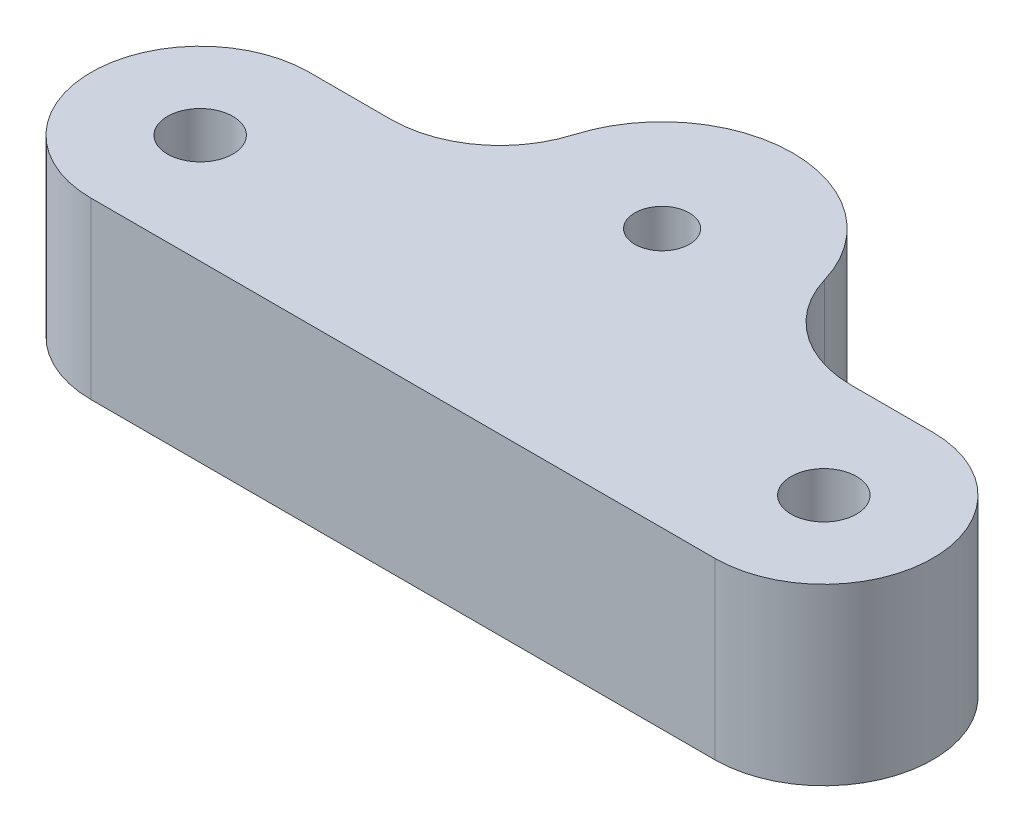
ISO-10303-21;
HEADER;
FILE_DESCRIPTION(('STEP AP214'),'2;1');
FILE_NAME('part.step','',(''),(''),'','','');
FILE_SCHEMA(('AUTOMOTIVE_DESIGN { 1 0 10303 214 1 1 1 1 }'));
ENDSEC;
DATA;
#1=APPLICATION_CONTEXT('core data for automotive mechanical design processes');
#2=APPLICATION_PROTOCOL_DEFINITION('international standard','automotive_design',2000,#1);
#3=PRODUCT_CONTEXT('',#1,'mechanical');
#4=PRODUCT('Part','Part','',(#3));
#5=PRODUCT_RELATED_PRODUCT_CATEGORY('part','',(#4));
#6=PRODUCT_DEFINITION_FORMATION('','',#4);
#7=PRODUCT_DEFINITION_CONTEXT('part definition',#1,'design');
#8=PRODUCT_DEFINITION('design','',#6,#7);
#9=PRODUCT_DEFINITION_SHAPE('','',#8);
#10=(LENGTH_UNIT() NAMED_UNIT(*) SI_UNIT(.MILLI.,.METRE.));
#11=(NAMED_UNIT(*) PLANE_ANGLE_UNIT() SI_UNIT($,.RADIAN.));
#12=(NAMED_UNIT(*) SI_UNIT($,.STERADIAN.) SOLID_ANGLE_UNIT());
#13=UNCERTAINTY_MEASURE_WITH_UNIT(LENGTH_MEASURE(1.E-05),#10,'distance_accuracy_value','');
#14=(GEOMETRIC_REPRESENTATION_CONTEXT(3) GLOBAL_UNCERTAINTY_ASSIGNED_CONTEXT((#13)) GLOBAL_UNIT_ASSIGNED_CONTEXT((#10,
#11,#12)) REPRESENTATION_CONTEXT('',''));
#15=CARTESIAN_POINT('',(0.,0.,0.));
#16=DIRECTION('',(0.,0.,1.));
#17=DIRECTION('',(1.,0.,0.));
#18=AXIS2_PLACEMENT_3D('',#15,#16,#17);
#19=CARTESIAN_POINT('',(-14.295,8.,-5.));
#20=DIRECTION('',(0.,0.,1.));
#21=DIRECTION('',(1.,0.,0.));
#22=AXIS2_PLACEMENT_3D('',#19,#20,#21);
#23=PLANE('',#22);
#24=DIRECTION('',(-1.,0.,0.));
#25=VECTOR('',#24,1.);
#26=CARTESIAN_POINT('',(-14.295,0.,-5.));
#27=LINE('',#26,#25);
#28=CARTESIAN_POINT('',(14.295,0.,-5.00000000000001));
#29=VERTEX_POINT('',#28);
#30=CARTESIAN_POINT('',(10.5482510398644,0.,-5.));
#31=VERTEX_POINT('',#30);
#32=EDGE_CURVE('E122',#29,#31,#27,.T.);
#33=ORIENTED_EDGE('',*,*,#32,.T.);
#34=DIRECTION('',(0.,1.,0.));
#35=VECTOR('',#34,1.);
#36=CARTESIAN_POINT('',(10.5482510398644,8.,-5.));
#37=LINE('',#36,#35);
#38=CARTESIAN_POINT('',(10.5482510398644,8.,-5.));
#39=VERTEX_POINT('',#38);
#40=EDGE_CURVE('E139',#31,#39,#37,.T.);
#41=ORIENTED_EDGE('',*,*,#40,.T.);
#42=DIRECTION('',(-1.,0.,0.));
#43=VECTOR('',#42,1.);
#44=CARTESIAN_POINT('',(-14.295,8.,-5.));
#45=LINE('',#44,#43);
#46=CARTESIAN_POINT('',(14.295,8.,-5.00000000000001));
#47=VERTEX_POINT('',#46);
#48=EDGE_CURVE('E149',#47,#39,#45,.T.);
#49=ORIENTED_EDGE('',*,*,#48,.F.);
#50=DIRECTION('',(0.,-1.,0.));
#51=VECTOR('',#50,1.);
#52=CARTESIAN_POINT('',(14.295,8.,-5.00000000000001));
#53=LINE('',#52,#51);
#54=EDGE_CURVE('E131',#47,#29,#53,.T.);
#55=ORIENTED_EDGE('',*,*,#54,.T.);
#56=EDGE_LOOP('',(#33,#41,#49,#55));
#57=FACE_BOUND('',#56,.T.);
#58=ADVANCED_FACE('F36',(#57),#23,.F.);
#59=CARTESIAN_POINT('',(-14.295,8.,0.));
#60=DIRECTION('',(0.,1.,0.));
#61=DIRECTION('',(0.,0.,1.));
#62=AXIS2_PLACEMENT_3D('',#59,#60,#61);
#63=PLANE('',#62);
#64=CARTESIAN_POINT('',(0.,8.,-6.88000000000001));
#65=DIRECTION('',(0.,-1.,0.));
#66=DIRECTION('',(0.,0.,-1.));
#67=AXIS2_PLACEMENT_3D('',#64,#65,#66);
#68=CIRCLE('',#67,1.25);
#69=CARTESIAN_POINT('',(0.,8.,-8.13));
#70=VERTEX_POINT('',#69);
#71=EDGE_CURVE('E230',#70,#70,#68,.T.);
#72=ORIENTED_EDGE('',*,*,#71,.T.);
#73=EDGE_LOOP('',(#72));
#74=FACE_BOUND('',#73,.T.);
#75=CARTESIAN_POINT('',(-14.295,8.,0.));
#76=DIRECTION('',(0.,1.,0.));
#77=DIRECTION('',(0.,0.,1.));
#78=AXIS2_PLACEMENT_3D('',#75,#76,#77);
#79=CIRCLE('',#78,1.5);
#80=CARTESIAN_POINT('',(-14.295,8.,1.5));
#81=VERTEX_POINT('',#80);
#82=EDGE_CURVE('E172',#81,#81,#79,.T.);
#83=ORIENTED_EDGE('',*,*,#82,.F.);
#84=EDGE_LOOP('',(#83));
#85=FACE_BOUND('',#84,.T.);
#86=CARTESIAN_POINT('',(-14.295,8.,0.));
#87=DIRECTION('',(0.,1.,0.));
#88=DIRECTION('',(0.,0.,1.));
#89=AXIS2_PLACEMENT_3D('',#86,#87,#88);
#90=CIRCLE('',#89,5.);
#91=CARTESIAN_POINT('',(-14.295,8.,-5.));
#92=VERTEX_POINT('',#91);
#93=CARTESIAN_POINT('',(-14.295,8.,5.));
#94=VERTEX_POINT('',#93);
#95=EDGE_CURVE('E112',#92,#94,#90,.T.);
#96=ORIENTED_EDGE('',*,*,#95,.T.);
#97=DIRECTION('',(1.,0.,0.));
#98=VECTOR('',#97,1.);
#99=CARTESIAN_POINT('',(-14.295,8.,5.));
#100=LINE('',#99,#98);
#101=CARTESIAN_POINT('',(14.295,8.,4.99999999999999));
#102=VERTEX_POINT('',#101);
#103=EDGE_CURVE('E101',#94,#102,#100,.T.);
#104=ORIENTED_EDGE('',*,*,#103,.T.);
#105=CARTESIAN_POINT('',(14.295,8.,0.));
#106=DIRECTION('',(0.,1.,0.));
#107=DIRECTION('',(0.,0.,1.));
#108=AXIS2_PLACEMENT_3D('',#105,#106,#107);
#109=CIRCLE('',#108,5.);
#110=EDGE_CURVE('E111',#102,#47,#109,.T.);
#111=ORIENTED_EDGE('',*,*,#110,.T.);
#112=ORIENTED_EDGE('',*,*,#48,.T.);
#113=CARTESIAN_POINT('',(10.5482510398644,8.,-10.));
#114=DIRECTION('',(0.,1.,0.));
#115=DIRECTION('',(0.,0.,1.));
#116=AXIS2_PLACEMENT_3D('',#113,#114,#115);
#117=CIRCLE('',#116,5.);
#118=CARTESIAN_POINT('',(5.75359147628966,8.,-8.58181818181819));
#119=VERTEX_POINT('',#118);
#120=EDGE_CURVE('E44',#39,#119,#117,.F.);
#121=ORIENTED_EDGE('',*,*,#120,.T.);
#122=CARTESIAN_POINT('',(0.,8.,-6.88000000000001));
#123=DIRECTION('',(0.,1.,0.));
#124=DIRECTION('',(0.,0.,1.));
#125=AXIS2_PLACEMENT_3D('',#122,#123,#124);
#126=CIRCLE('',#125,6.);
#127=CARTESIAN_POINT('',(-5.75359147628966,8.,-8.58181818181818));
#128=VERTEX_POINT('',#127);
#129=EDGE_CURVE('E147',#119,#128,#126,.T.);
#130=ORIENTED_EDGE('',*,*,#129,.T.);
#131=CARTESIAN_POINT('',(-10.5482510398644,8.,-10.));
#132=DIRECTION('',(0.,1.,0.));
#133=DIRECTION('',(0.,0.,1.));
#134=AXIS2_PLACEMENT_3D('',#131,#132,#133);
#135=CIRCLE('',#134,5.);
#136=CARTESIAN_POINT('',(-10.5482510398644,8.,-5.));
#137=VERTEX_POINT('',#136);
#138=EDGE_CURVE('E141',#128,#137,#135,.F.);
#139=ORIENTED_EDGE('',*,*,#138,.T.);
#140=EDGE_CURVE('E118',#137,#92,#45,.T.);
#141=ORIENTED_EDGE('',*,*,#140,.T.);
#142=EDGE_LOOP('',(#96,#104,#111,#112,#121,#130,#139,#141));
#143=FACE_BOUND('',#142,.T.);
#144=CARTESIAN_POINT('',(14.295,8.,0.));
#145=DIRECTION('',(0.,1.,0.));
#146=DIRECTION('',(0.,0.,1.));
#147=AXIS2_PLACEMENT_3D('',#144,#145,#146);
#148=CIRCLE('',#147,1.5);
#149=CARTESIAN_POINT('',(14.295,8.,1.49999999999999));
#150=VERTEX_POINT('',#149);
#151=EDGE_CURVE('E244',#150,#150,#148,.T.);
#152=ORIENTED_EDGE('',*,*,#151,.F.);
#153=EDGE_LOOP('',(#152));
#154=FACE_BOUND('',#153,.T.);
#155=ADVANCED_FACE('F115',(#74,#85,#143,#154),#63,.T.);
#156=CARTESIAN_POINT('',(-14.295,0.,0.));
#157=DIRECTION('',(0.,1.,0.));
#158=DIRECTION('',(0.,0.,1.));
#159=AXIS2_PLACEMENT_3D('',#156,#157,#158);
#160=PLANE('',#159);
#161=CARTESIAN_POINT('',(0.,0.,-6.88000000000001));
#162=DIRECTION('',(0.,-1.,0.));
#163=DIRECTION('',(0.,0.,-1.));
#164=AXIS2_PLACEMENT_3D('',#161,#162,#163);
#165=CIRCLE('',#164,3.25);
#166=CARTESIAN_POINT('',(0.,0.,-10.13));
#167=VERTEX_POINT('',#166);
#168=EDGE_CURVE('E235',#167,#167,#165,.T.);
#169=ORIENTED_EDGE('',*,*,#168,.F.);
#170=EDGE_LOOP('',(#169));
#171=FACE_BOUND('',#170,.T.);
#172=CARTESIAN_POINT('',(-14.295,0.,0.));
#173=DIRECTION('',(0.,1.,0.));
#174=DIRECTION('',(0.,0.,1.));
#175=AXIS2_PLACEMENT_3D('',#172,#173,#174);
#176=CIRCLE('',#175,5.);
#177=CARTESIAN_POINT('',(-14.295,0.,-5.));
#178=VERTEX_POINT('',#177);
#179=CARTESIAN_POINT('',(-14.295,0.,5.));
#180=VERTEX_POINT('',#179);
#181=EDGE_CURVE('E126',#178,#180,#176,.T.);
#182=ORIENTED_EDGE('',*,*,#181,.F.);
#183=CARTESIAN_POINT('',(-10.5482510398644,0.,-5.));
#184=VERTEX_POINT('',#183);
#185=EDGE_CURVE('E161',#184,#178,#27,.T.);
#186=ORIENTED_EDGE('',*,*,#185,.F.);
#187=CARTESIAN_POINT('',(-10.5482510398644,0.,-10.));
#188=DIRECTION('',(0.,1.,0.));
#189=DIRECTION('',(0.,0.,1.));
#190=AXIS2_PLACEMENT_3D('',#187,#188,#189);
#191=CIRCLE('',#190,5.);
#192=CARTESIAN_POINT('',(-5.75359147628966,0.,-8.58181818181818));
#193=VERTEX_POINT('',#192);
#194=EDGE_CURVE('E143',#184,#193,#191,.T.);
#195=ORIENTED_EDGE('',*,*,#194,.T.);
#196=CARTESIAN_POINT('',(0.,0.,-6.88000000000001));
#197=DIRECTION('',(0.,1.,0.));
#198=DIRECTION('',(0.,0.,1.));
#199=AXIS2_PLACEMENT_3D('',#196,#197,#198);
#200=CIRCLE('',#199,6.);
#201=CARTESIAN_POINT('',(5.75359147628966,0.,-8.58181818181819));
#202=VERTEX_POINT('',#201);
#203=EDGE_CURVE('E154',#202,#193,#200,.T.);
#204=ORIENTED_EDGE('',*,*,#203,.F.);
#205=CARTESIAN_POINT('',(10.5482510398644,0.,-10.));
#206=DIRECTION('',(0.,1.,0.));
#207=DIRECTION('',(0.,0.,1.));
#208=AXIS2_PLACEMENT_3D('',#205,#206,#207);
#209=CIRCLE('',#208,5.);
#210=EDGE_CURVE('E11',#202,#31,#209,.T.);
#211=ORIENTED_EDGE('',*,*,#210,.T.);
#212=ORIENTED_EDGE('',*,*,#32,.F.);
#213=CARTESIAN_POINT('',(14.295,0.,0.));
#214=DIRECTION('',(0.,1.,0.));
#215=DIRECTION('',(0.,0.,1.));
#216=AXIS2_PLACEMENT_3D('',#213,#214,#215);
#217=CIRCLE('',#216,5.);
#218=CARTESIAN_POINT('',(14.295,0.,4.99999999999999));
#219=VERTEX_POINT('',#218);
#220=EDGE_CURVE('E163',#219,#29,#217,.T.);
#221=ORIENTED_EDGE('',*,*,#220,.F.);
#222=DIRECTION('',(1.,0.,0.));
#223=VECTOR('',#222,1.);
#224=CARTESIAN_POINT('',(-14.295,0.,5.));
#225=LINE('',#224,#223);
#226=EDGE_CURVE('E171',#180,#219,#225,.T.);
#227=ORIENTED_EDGE('',*,*,#226,.F.);
#228=EDGE_LOOP('',(#182,#186,#195,#204,#211,#212,#221,#227));
#229=FACE_BOUND('',#228,.T.);
#230=CARTESIAN_POINT('',(-14.295,0.,0.));
#231=DIRECTION('',(0.,1.,0.));
#232=DIRECTION('',(0.,0.,1.));
#233=AXIS2_PLACEMENT_3D('',#230,#231,#232);
#234=CIRCLE('',#233,1.5);
#235=CARTESIAN_POINT('',(-14.295,0.,1.5));
#236=VERTEX_POINT('',#235);
#237=EDGE_CURVE('E247',#236,#236,#234,.T.);
#238=ORIENTED_EDGE('',*,*,#237,.T.);
#239=EDGE_LOOP('',(#238));
#240=FACE_BOUND('',#239,.T.);
#241=CARTESIAN_POINT('',(14.295,0.,0.));
#242=DIRECTION('',(0.,1.,0.));
#243=DIRECTION('',(0.,0.,1.));
#244=AXIS2_PLACEMENT_3D('',#241,#242,#243);
#245=CIRCLE('',#244,1.5);
#246=CARTESIAN_POINT('',(14.295,0.,1.49999999999999));
#247=VERTEX_POINT('',#246);
#248=EDGE_CURVE('E242',#247,#247,#245,.T.);
#249=ORIENTED_EDGE('',*,*,#248,.T.);
#250=EDGE_LOOP('',(#249));
#251=FACE_BOUND('',#250,.T.);
#252=ADVANCED_FACE('F175',(#171,#229,#240,#251),#160,.F.);
#253=CARTESIAN_POINT('',(-14.295,8.,0.));
#254=DIRECTION('',(0.,-1.,0.));
#255=DIRECTION('',(0.,0.,-1.));
#256=AXIS2_PLACEMENT_3D('',#253,#254,#255);
#257=CYLINDRICAL_SURFACE('',#256,5.);
#258=ORIENTED_EDGE('',*,*,#181,.T.);
#259=DIRECTION('',(0.,-1.,0.));
#260=VECTOR('',#259,1.);
#261=CARTESIAN_POINT('',(-14.295,8.,5.));
#262=LINE('',#261,#260);
#263=EDGE_CURVE('E105',#94,#180,#262,.T.);
#264=ORIENTED_EDGE('',*,*,#263,.F.);
#265=ORIENTED_EDGE('',*,*,#95,.F.);
#266=DIRECTION('',(0.,-1.,0.));
#267=VECTOR('',#266,1.);
#268=CARTESIAN_POINT('',(-14.295,8.,-5.));
#269=LINE('',#268,#267);
#270=EDGE_CURVE('E167',#92,#178,#269,.T.);
#271=ORIENTED_EDGE('',*,*,#270,.T.);
#272=EDGE_LOOP('',(#258,#264,#265,#271));
#273=FACE_BOUND('',#272,.T.);
#274=ADVANCED_FACE('F124',(#273),#257,.T.);
#275=CARTESIAN_POINT('',(-14.295,8.,5.));
#276=DIRECTION('',(0.,0.,-1.));
#277=DIRECTION('',(-1.,0.,0.));
#278=AXIS2_PLACEMENT_3D('',#275,#276,#277);
#279=PLANE('',#278);
#280=ORIENTED_EDGE('',*,*,#226,.T.);
#281=DIRECTION('',(0.,-1.,0.));
#282=VECTOR('',#281,1.);
#283=CARTESIAN_POINT('',(14.295,8.,4.99999999999999));
#284=LINE('',#283,#282);
#285=EDGE_CURVE('E108',#102,#219,#284,.T.);
#286=ORIENTED_EDGE('',*,*,#285,.F.);
#287=ORIENTED_EDGE('',*,*,#103,.F.);
#288=ORIENTED_EDGE('',*,*,#263,.T.);
#289=EDGE_LOOP('',(#280,#286,#287,#288));
#290=FACE_BOUND('',#289,.T.);
#291=ADVANCED_FACE('F103',(#290),#279,.F.);
#292=CARTESIAN_POINT('',(14.295,8.,0.));
#293=DIRECTION('',(0.,-1.,0.));
#294=DIRECTION('',(0.,0.,-1.));
#295=AXIS2_PLACEMENT_3D('',#292,#293,#294);
#296=CYLINDRICAL_SURFACE('',#295,5.);
#297=ORIENTED_EDGE('',*,*,#220,.T.);
#298=ORIENTED_EDGE('',*,*,#54,.F.);
#299=ORIENTED_EDGE('',*,*,#110,.F.);
#300=ORIENTED_EDGE('',*,*,#285,.T.);
#301=EDGE_LOOP('',(#297,#298,#299,#300));
#302=FACE_BOUND('',#301,.T.);
#303=ADVANCED_FACE('F174',(#302),#296,.T.);
#304=ORIENTED_EDGE('',*,*,#140,.F.);
#305=DIRECTION('',(0.,1.,0.));
#306=VECTOR('',#305,1.);
#307=CARTESIAN_POINT('',(-10.5482510398644,8.,-5.));
#308=LINE('',#307,#306);
#309=EDGE_CURVE('E137',#137,#184,#308,.F.);
#310=ORIENTED_EDGE('',*,*,#309,.T.);
#311=ORIENTED_EDGE('',*,*,#185,.T.);
#312=ORIENTED_EDGE('',*,*,#270,.F.);
#313=EDGE_LOOP('',(#304,#310,#311,#312));
#314=FACE_BOUND('',#313,.T.);
#315=ADVANCED_FACE('F183',(#314),#23,.F.);
#316=CARTESIAN_POINT('',(-14.295,8.,0.));
#317=DIRECTION('',(0.,-1.,0.));
#318=DIRECTION('',(0.,0.,-1.));
#319=AXIS2_PLACEMENT_3D('',#316,#317,#318);
#320=CYLINDRICAL_SURFACE('',#319,1.5);
#321=ORIENTED_EDGE('',*,*,#82,.T.);
#322=EDGE_LOOP('',(#321));
#323=FACE_BOUND('',#322,.T.);
#324=ORIENTED_EDGE('',*,*,#237,.F.);
#325=EDGE_LOOP('',(#324));
#326=FACE_BOUND('',#325,.T.);
#327=ADVANCED_FACE('F185',(#323,#326),#320,.F.);
#328=CARTESIAN_POINT('',(14.295,8.,0.));
#329=DIRECTION('',(0.,-1.,0.));
#330=DIRECTION('',(0.,0.,-1.));
#331=AXIS2_PLACEMENT_3D('',#328,#329,#330);
#332=CYLINDRICAL_SURFACE('',#331,1.5);
#333=ORIENTED_EDGE('',*,*,#151,.T.);
#334=EDGE_LOOP('',(#333));
#335=FACE_BOUND('',#334,.T.);
#336=ORIENTED_EDGE('',*,*,#248,.F.);
#337=EDGE_LOOP('',(#336));
#338=FACE_BOUND('',#337,.T.);
#339=ADVANCED_FACE('F191',(#335,#338),#332,.F.);
#340=CARTESIAN_POINT('',(0.,0.,-6.88000000000001));
#341=DIRECTION('',(0.,1.,0.));
#342=DIRECTION('',(0.,0.,1.));
#343=AXIS2_PLACEMENT_3D('',#340,#341,#342);
#344=CYLINDRICAL_SURFACE('',#343,6.);
#345=ORIENTED_EDGE('',*,*,#203,.T.);
#346=DIRECTION('',(0.,1.,0.));
#347=VECTOR('',#346,1.);
#348=CARTESIAN_POINT('',(-5.75359147628966,0.,-8.58181818181818));
#349=LINE('',#348,#347);
#350=EDGE_CURVE('E129',#193,#128,#349,.T.);
#351=ORIENTED_EDGE('',*,*,#350,.T.);
#352=ORIENTED_EDGE('',*,*,#129,.F.);
#353=DIRECTION('',(0.,1.,0.));
#354=VECTOR('',#353,1.);
#355=CARTESIAN_POINT('',(5.75359147628966,0.,-8.58181818181819));
#356=LINE('',#355,#354);
#357=EDGE_CURVE('E127',#119,#202,#356,.F.);
#358=ORIENTED_EDGE('',*,*,#357,.T.);
#359=EDGE_LOOP('',(#345,#351,#352,#358));
#360=FACE_BOUND('',#359,.T.);
#361=ADVANCED_FACE('F152',(#360),#344,.T.);
#362=CARTESIAN_POINT('',(0.,4.,-6.88000000000001));
#363=DIRECTION('',(0.,-1.,0.));
#364=DIRECTION('',(0.,0.,-1.));
#365=AXIS2_PLACEMENT_3D('',#362,#363,#364);
#366=CYLINDRICAL_SURFACE('',#365,3.25);
#367=CARTESIAN_POINT('',(0.,4.,-6.88000000000001));
#368=DIRECTION('',(0.,-1.,0.));
#369=DIRECTION('',(0.,0.,-1.));
#370=AXIS2_PLACEMENT_3D('',#367,#368,#369);
#371=CIRCLE('',#370,3.25);
#372=CARTESIAN_POINT('',(0.,4.,-10.13));
#373=VERTEX_POINT('',#372);
#374=EDGE_CURVE('E155',#373,#373,#371,.T.);
#375=ORIENTED_EDGE('',*,*,#374,.F.);
#376=EDGE_LOOP('',(#375));
#377=FACE_BOUND('',#376,.T.);
#378=ORIENTED_EDGE('',*,*,#168,.T.);
#379=EDGE_LOOP('',(#378));
#380=FACE_BOUND('',#379,.T.);
#381=ADVANCED_FACE('F214',(#377,#380),#366,.F.);
#382=CARTESIAN_POINT('',(0.,4.,-6.88000000000001));
#383=DIRECTION('',(0.,-1.,0.));
#384=DIRECTION('',(0.,0.,-1.));
#385=AXIS2_PLACEMENT_3D('',#382,#383,#384);
#386=PLANE('',#385);
#387=CARTESIAN_POINT('',(0.,4.,-6.88000000000001));
#388=DIRECTION('',(0.,-1.,0.));
#389=DIRECTION('',(0.,0.,-1.));
#390=AXIS2_PLACEMENT_3D('',#387,#388,#389);
#391=CIRCLE('',#390,1.24999999999999);
#392=CARTESIAN_POINT('',(0.,4.,-8.12999999999999));
#393=VERTEX_POINT('',#392);
#394=EDGE_CURVE('E233',#393,#393,#391,.T.);
#395=ORIENTED_EDGE('',*,*,#394,.F.);
#396=EDGE_LOOP('',(#395));
#397=FACE_BOUND('',#396,.T.);
#398=ORIENTED_EDGE('',*,*,#374,.T.);
#399=EDGE_LOOP('',(#398));
#400=FACE_BOUND('',#399,.T.);
#401=ADVANCED_FACE('F217',(#397,#400),#386,.T.);
#402=CARTESIAN_POINT('',(-10.5482510398644,0.,-10.));
#403=DIRECTION('',(0.,1.,0.));
#404=DIRECTION('',(0.,0.,1.));
#405=AXIS2_PLACEMENT_3D('',#402,#403,#404);
#406=CYLINDRICAL_SURFACE('',#405,5.);
#407=ORIENTED_EDGE('',*,*,#194,.F.);
#408=ORIENTED_EDGE('',*,*,#309,.F.);
#409=ORIENTED_EDGE('',*,*,#138,.F.);
#410=ORIENTED_EDGE('',*,*,#350,.F.);
#411=EDGE_LOOP('',(#407,#408,#409,#410));
#412=FACE_BOUND('',#411,.T.);
#413=ADVANCED_FACE('F182',(#412),#406,.F.);
#414=CARTESIAN_POINT('',(10.5482510398644,0.,-10.));
#415=DIRECTION('',(0.,1.,0.));
#416=DIRECTION('',(0.,0.,1.));
#417=AXIS2_PLACEMENT_3D('',#414,#415,#416);
#418=CYLINDRICAL_SURFACE('',#417,5.);
#419=ORIENTED_EDGE('',*,*,#210,.F.);
#420=ORIENTED_EDGE('',*,*,#357,.F.);
#421=ORIENTED_EDGE('',*,*,#120,.F.);
#422=ORIENTED_EDGE('',*,*,#40,.F.);
#423=EDGE_LOOP('',(#419,#420,#421,#422));
#424=FACE_BOUND('',#423,.T.);
#425=ADVANCED_FACE('F38',(#424),#418,.F.);
#426=CARTESIAN_POINT('',(0.,4.,-6.88000000000001));
#427=DIRECTION('',(0.,-1.,0.));
#428=DIRECTION('',(0.,0.,-1.));
#429=AXIS2_PLACEMENT_3D('',#426,#427,#428);
#430=CYLINDRICAL_SURFACE('',#429,1.24999999999999);
#431=ORIENTED_EDGE('',*,*,#71,.F.);
#432=EDGE_LOOP('',(#431));
#433=FACE_BOUND('',#432,.T.);
#434=ORIENTED_EDGE('',*,*,#394,.T.);
#435=EDGE_LOOP('',(#434));
#436=FACE_BOUND('',#435,.T.);
#437=ADVANCED_FACE('F222',(#433,#436),#430,.F.);
#438=CLOSED_SHELL('',(#58,#155,#252,#274,#291,#303,#315,#327,#339,#361,#381,#401,#413,#425,#437));
#439=MANIFOLD_SOLID_BREP('B2',#438);
#440=ADVANCED_BREP_SHAPE_REPRESENTATION('',(#18,#439),#14);
#441=SHAPE_DEFINITION_REPRESENTATION(#9,#440);
ENDSEC;
END-ISO-10303-21;
